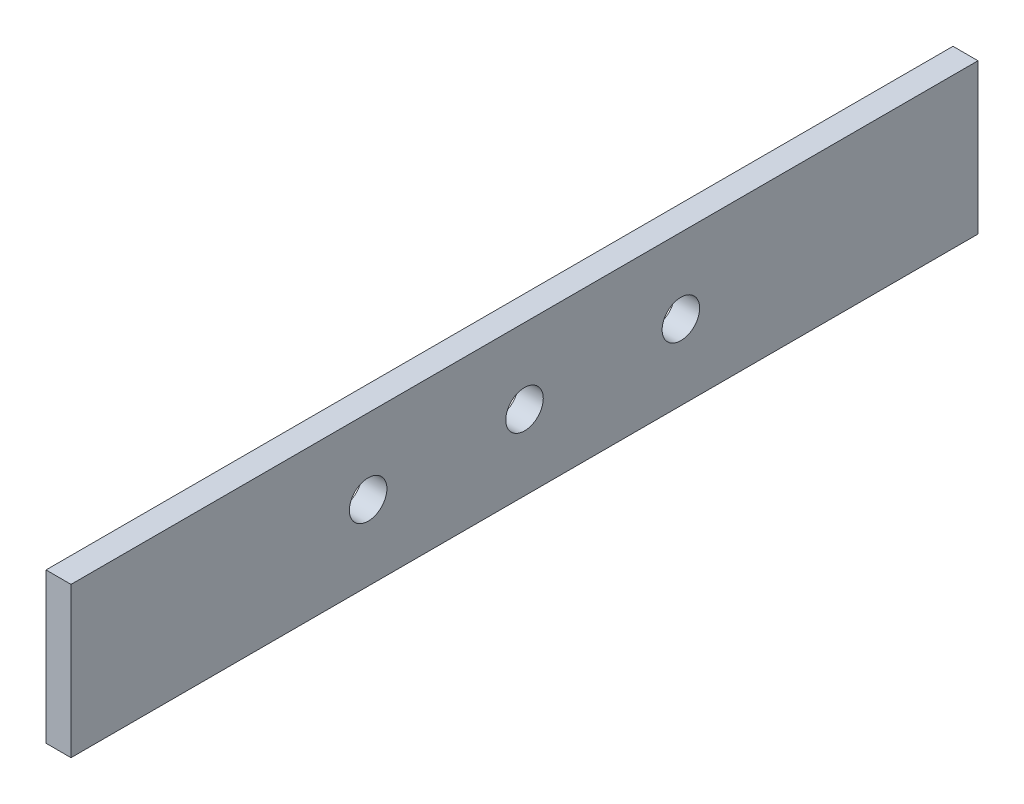
ISO-10303-21;
HEADER;
FILE_DESCRIPTION(('STEP AP214'),'2;1');
FILE_NAME('part.step','',(''),(''),'','','');
FILE_SCHEMA(('AUTOMOTIVE_DESIGN { 1 0 10303 214 1 1 1 1 }'));
ENDSEC;
DATA;
#1=APPLICATION_CONTEXT('core data for automotive mechanical design processes');
#2=APPLICATION_PROTOCOL_DEFINITION('international standard','automotive_design',2000,#1);
#3=PRODUCT_CONTEXT('',#1,'mechanical');
#4=PRODUCT('Part','Part','',(#3));
#5=PRODUCT_RELATED_PRODUCT_CATEGORY('part','',(#4));
#6=PRODUCT_DEFINITION_FORMATION('','',#4);
#7=PRODUCT_DEFINITION_CONTEXT('part definition',#1,'design');
#8=PRODUCT_DEFINITION('design','',#6,#7);
#9=PRODUCT_DEFINITION_SHAPE('','',#8);
#10=(LENGTH_UNIT() NAMED_UNIT(*) SI_UNIT(.MILLI.,.METRE.));
#11=(NAMED_UNIT(*) PLANE_ANGLE_UNIT() SI_UNIT($,.RADIAN.));
#12=(NAMED_UNIT(*) SI_UNIT($,.STERADIAN.) SOLID_ANGLE_UNIT());
#13=UNCERTAINTY_MEASURE_WITH_UNIT(LENGTH_MEASURE(1.E-05),#10,'distance_accuracy_value','');
#14=(GEOMETRIC_REPRESENTATION_CONTEXT(3) GLOBAL_UNCERTAINTY_ASSIGNED_CONTEXT((#13)) GLOBAL_UNIT_ASSIGNED_CONTEXT((#10,
#11,#12)) REPRESENTATION_CONTEXT('',''));
#15=CARTESIAN_POINT('',(0.,0.,0.));
#16=DIRECTION('',(0.,0.,1.));
#17=DIRECTION('',(1.,0.,0.));
#18=AXIS2_PLACEMENT_3D('',#15,#16,#17);
#19=CARTESIAN_POINT('',(2.,12.,23.7475677229017));
#20=DIRECTION('',(0.,0.,-1.));
#21=DIRECTION('',(-1.,0.,0.));
#22=AXIS2_PLACEMENT_3D('',#19,#20,#21);
#23=PLANE('',#22);
#24=DIRECTION('',(0.,-1.,0.));
#25=VECTOR('',#24,1.);
#26=CARTESIAN_POINT('',(0.,12.,23.7475677229017));
#27=LINE('',#26,#25);
#28=CARTESIAN_POINT('',(0.,12.,23.7475677229017));
#29=VERTEX_POINT('',#28);
#30=CARTESIAN_POINT('',(0.,0.,23.7475677229017));
#31=VERTEX_POINT('',#30);
#32=EDGE_CURVE('E96',#29,#31,#27,.T.);
#33=ORIENTED_EDGE('',*,*,#32,.T.);
#34=DIRECTION('',(-1.,0.,0.));
#35=VECTOR('',#34,1.);
#36=CARTESIAN_POINT('',(2.,0.,23.7475677229017));
#37=LINE('',#36,#35);
#38=CARTESIAN_POINT('',(2.,0.,23.7475677229017));
#39=VERTEX_POINT('',#38);
#40=EDGE_CURVE('E11',#39,#31,#37,.T.);
#41=ORIENTED_EDGE('',*,*,#40,.F.);
#42=DIRECTION('',(0.,-1.,0.));
#43=VECTOR('',#42,1.);
#44=CARTESIAN_POINT('',(2.,12.,23.7475677229017));
#45=LINE('',#44,#43);
#46=CARTESIAN_POINT('',(2.,12.,23.7475677229017));
#47=VERTEX_POINT('',#46);
#48=EDGE_CURVE('E84',#47,#39,#45,.T.);
#49=ORIENTED_EDGE('',*,*,#48,.F.);
#50=DIRECTION('',(-1.,0.,0.));
#51=VECTOR('',#50,1.);
#52=CARTESIAN_POINT('',(2.,12.,23.7475677229017));
#53=LINE('',#52,#51);
#54=EDGE_CURVE('E92',#47,#29,#53,.T.);
#55=ORIENTED_EDGE('',*,*,#54,.T.);
#56=EDGE_LOOP('',(#33,#41,#49,#55));
#57=FACE_BOUND('',#56,.T.);
#58=ADVANCED_FACE('F33',(#57),#23,.F.);
#59=CARTESIAN_POINT('',(2.,0.,23.7475677229017));
#60=DIRECTION('',(0.,1.,0.));
#61=DIRECTION('',(0.,0.,1.));
#62=AXIS2_PLACEMENT_3D('',#59,#60,#61);
#63=PLANE('',#62);
#64=DIRECTION('',(0.,0.,-1.));
#65=VECTOR('',#64,1.);
#66=CARTESIAN_POINT('',(0.,0.,23.7475677229017));
#67=LINE('',#66,#65);
#68=CARTESIAN_POINT('',(0.,0.,-48.7524322770983));
#69=VERTEX_POINT('',#68);
#70=EDGE_CURVE('E88',#31,#69,#67,.T.);
#71=ORIENTED_EDGE('',*,*,#70,.T.);
#72=DIRECTION('',(-1.,0.,0.));
#73=VECTOR('',#72,1.);
#74=CARTESIAN_POINT('',(2.,0.,-48.7524322770983));
#75=LINE('',#74,#73);
#76=CARTESIAN_POINT('',(2.,0.,-48.7524322770983));
#77=VERTEX_POINT('',#76);
#78=EDGE_CURVE('E41',#77,#69,#75,.T.);
#79=ORIENTED_EDGE('',*,*,#78,.F.);
#80=DIRECTION('',(0.,0.,-1.));
#81=VECTOR('',#80,1.);
#82=CARTESIAN_POINT('',(2.,0.,23.7475677229017));
#83=LINE('',#82,#81);
#84=EDGE_CURVE('E79',#39,#77,#83,.T.);
#85=ORIENTED_EDGE('',*,*,#84,.F.);
#86=ORIENTED_EDGE('',*,*,#40,.T.);
#87=EDGE_LOOP('',(#71,#79,#85,#86));
#88=FACE_BOUND('',#87,.T.);
#89=ADVANCED_FACE('F87',(#88),#63,.F.);
#90=CARTESIAN_POINT('',(2.,0.,-48.7524322770983));
#91=DIRECTION('',(0.,0.,1.));
#92=DIRECTION('',(1.,0.,0.));
#93=AXIS2_PLACEMENT_3D('',#90,#91,#92);
#94=PLANE('',#93);
#95=DIRECTION('',(0.,1.,0.));
#96=VECTOR('',#95,1.);
#97=CARTESIAN_POINT('',(0.,0.,-48.7524322770983));
#98=LINE('',#97,#96);
#99=CARTESIAN_POINT('',(0.,12.,-48.7524322770983));
#100=VERTEX_POINT('',#99);
#101=EDGE_CURVE('E66',#69,#100,#98,.T.);
#102=ORIENTED_EDGE('',*,*,#101,.T.);
#103=DIRECTION('',(-1.,0.,0.));
#104=VECTOR('',#103,1.);
#105=CARTESIAN_POINT('',(2.,12.,-48.7524322770983));
#106=LINE('',#105,#104);
#107=CARTESIAN_POINT('',(2.,12.,-48.7524322770983));
#108=VERTEX_POINT('',#107);
#109=EDGE_CURVE('E89',#108,#100,#106,.T.);
#110=ORIENTED_EDGE('',*,*,#109,.F.);
#111=DIRECTION('',(0.,1.,0.));
#112=VECTOR('',#111,1.);
#113=CARTESIAN_POINT('',(2.,0.,-48.7524322770983));
#114=LINE('',#113,#112);
#115=EDGE_CURVE('E82',#77,#108,#114,.T.);
#116=ORIENTED_EDGE('',*,*,#115,.F.);
#117=ORIENTED_EDGE('',*,*,#78,.T.);
#118=EDGE_LOOP('',(#102,#110,#116,#117));
#119=FACE_BOUND('',#118,.T.);
#120=ADVANCED_FACE('F90',(#119),#94,.F.);
#121=CARTESIAN_POINT('',(2.,12.,-48.7524322770983));
#122=DIRECTION('',(0.,-1.,0.));
#123=DIRECTION('',(0.,0.,-1.));
#124=AXIS2_PLACEMENT_3D('',#121,#122,#123);
#125=PLANE('',#124);
#126=DIRECTION('',(0.,0.,1.));
#127=VECTOR('',#126,1.);
#128=CARTESIAN_POINT('',(0.,12.,-48.7524322770983));
#129=LINE('',#128,#127);
#130=EDGE_CURVE('E72',#100,#29,#129,.T.);
#131=ORIENTED_EDGE('',*,*,#130,.T.);
#132=ORIENTED_EDGE('',*,*,#54,.F.);
#133=DIRECTION('',(0.,0.,1.));
#134=VECTOR('',#133,1.);
#135=CARTESIAN_POINT('',(2.,12.,-48.7524322770983));
#136=LINE('',#135,#134);
#137=EDGE_CURVE('E49',#108,#47,#136,.T.);
#138=ORIENTED_EDGE('',*,*,#137,.F.);
#139=ORIENTED_EDGE('',*,*,#109,.T.);
#140=EDGE_LOOP('',(#131,#132,#138,#139));
#141=FACE_BOUND('',#140,.T.);
#142=ADVANCED_FACE('F104',(#141),#125,.F.);
#143=CARTESIAN_POINT('',(2.,0.,0.));
#144=DIRECTION('',(1.,0.,0.));
#145=DIRECTION('',(0.,0.,-1.));
#146=AXIS2_PLACEMENT_3D('',#143,#144,#145);
#147=PLANE('',#146);
#148=CARTESIAN_POINT('',(2.,5.99999999999999,-25.0024322770983));
#149=DIRECTION('',(1.,0.,0.));
#150=DIRECTION('',(0.,0.,-1.));
#151=AXIS2_PLACEMENT_3D('',#148,#149,#150);
#152=CIRCLE('',#151,1.5);
#153=CARTESIAN_POINT('',(2.,5.99999999999999,-26.5024322770983));
#154=VERTEX_POINT('',#153);
#155=EDGE_CURVE('E120',#154,#154,#152,.T.);
#156=ORIENTED_EDGE('',*,*,#155,.F.);
#157=EDGE_LOOP('',(#156));
#158=FACE_BOUND('',#157,.T.);
#159=CARTESIAN_POINT('',(2.,5.99999999999999,-0.00243227709826113));
#160=DIRECTION('',(1.,0.,0.));
#161=DIRECTION('',(0.,0.,-1.));
#162=AXIS2_PLACEMENT_3D('',#159,#160,#161);
#163=CIRCLE('',#162,1.5);
#164=CARTESIAN_POINT('',(2.,5.99999999999999,-1.50243227709826));
#165=VERTEX_POINT('',#164);
#166=EDGE_CURVE('E119',#165,#165,#163,.T.);
#167=ORIENTED_EDGE('',*,*,#166,.F.);
#168=EDGE_LOOP('',(#167));
#169=FACE_BOUND('',#168,.T.);
#170=CARTESIAN_POINT('',(2.,5.99999999999999,-12.5024322770983));
#171=DIRECTION('',(1.,0.,0.));
#172=DIRECTION('',(0.,0.,-1.));
#173=AXIS2_PLACEMENT_3D('',#170,#171,#172);
#174=CIRCLE('',#173,1.5);
#175=CARTESIAN_POINT('',(2.,5.99999999999999,-14.0024322770983));
#176=VERTEX_POINT('',#175);
#177=EDGE_CURVE('E112',#176,#176,#174,.T.);
#178=ORIENTED_EDGE('',*,*,#177,.F.);
#179=EDGE_LOOP('',(#178));
#180=FACE_BOUND('',#179,.T.);
#181=ORIENTED_EDGE('',*,*,#48,.T.);
#182=ORIENTED_EDGE('',*,*,#84,.T.);
#183=ORIENTED_EDGE('',*,*,#115,.T.);
#184=ORIENTED_EDGE('',*,*,#137,.T.);
#185=EDGE_LOOP('',(#181,#182,#183,#184));
#186=FACE_BOUND('',#185,.T.);
#187=ADVANCED_FACE('F80',(#158,#169,#180,#186),#147,.T.);
#188=CARTESIAN_POINT('',(0.,0.,0.));
#189=DIRECTION('',(1.,0.,0.));
#190=DIRECTION('',(0.,0.,-1.));
#191=AXIS2_PLACEMENT_3D('',#188,#189,#190);
#192=PLANE('',#191);
#193=CARTESIAN_POINT('',(0.,5.99999999999999,-25.0024322770983));
#194=DIRECTION('',(1.,0.,0.));
#195=DIRECTION('',(0.,0.,-1.));
#196=AXIS2_PLACEMENT_3D('',#193,#194,#195);
#197=CIRCLE('',#196,1.5);
#198=CARTESIAN_POINT('',(0.,5.99999999999999,-26.5024322770983));
#199=VERTEX_POINT('',#198);
#200=EDGE_CURVE('E116',#199,#199,#197,.F.);
#201=ORIENTED_EDGE('',*,*,#200,.F.);
#202=EDGE_LOOP('',(#201));
#203=FACE_BOUND('',#202,.T.);
#204=CARTESIAN_POINT('',(0.,5.99999999999999,-0.00243227709826113));
#205=DIRECTION('',(1.,0.,0.));
#206=DIRECTION('',(0.,0.,-1.));
#207=AXIS2_PLACEMENT_3D('',#204,#205,#206);
#208=CIRCLE('',#207,1.5);
#209=CARTESIAN_POINT('',(0.,5.99999999999999,-1.50243227709826));
#210=VERTEX_POINT('',#209);
#211=EDGE_CURVE('E115',#210,#210,#208,.F.);
#212=ORIENTED_EDGE('',*,*,#211,.F.);
#213=EDGE_LOOP('',(#212));
#214=FACE_BOUND('',#213,.T.);
#215=CARTESIAN_POINT('',(0.,5.99999999999999,-12.5024322770983));
#216=DIRECTION('',(1.,0.,0.));
#217=DIRECTION('',(0.,0.,-1.));
#218=AXIS2_PLACEMENT_3D('',#215,#216,#217);
#219=CIRCLE('',#218,1.5);
#220=CARTESIAN_POINT('',(0.,5.99999999999999,-14.0024322770983));
#221=VERTEX_POINT('',#220);
#222=EDGE_CURVE('E99',#221,#221,#219,.F.);
#223=ORIENTED_EDGE('',*,*,#222,.F.);
#224=EDGE_LOOP('',(#223));
#225=FACE_BOUND('',#224,.T.);
#226=ORIENTED_EDGE('',*,*,#32,.F.);
#227=ORIENTED_EDGE('',*,*,#130,.F.);
#228=ORIENTED_EDGE('',*,*,#101,.F.);
#229=ORIENTED_EDGE('',*,*,#70,.F.);
#230=EDGE_LOOP('',(#226,#227,#228,#229));
#231=FACE_BOUND('',#230,.T.);
#232=ADVANCED_FACE('F107',(#203,#214,#225,#231),#192,.F.);
#233=CARTESIAN_POINT('',(-0.00100000000000013,5.99999999999999,-12.5024322770983));
#234=DIRECTION('',(1.,0.,0.));
#235=DIRECTION('',(0.,0.,-1.));
#236=AXIS2_PLACEMENT_3D('',#233,#234,#235);
#237=CYLINDRICAL_SURFACE('',#236,1.5);
#238=ORIENTED_EDGE('',*,*,#177,.T.);
#239=EDGE_LOOP('',(#238));
#240=FACE_BOUND('',#239,.T.);
#241=ORIENTED_EDGE('',*,*,#222,.T.);
#242=EDGE_LOOP('',(#241));
#243=FACE_BOUND('',#242,.T.);
#244=ADVANCED_FACE('F137',(#240,#243),#237,.F.);
#245=CARTESIAN_POINT('',(-0.00100000000000013,5.99999999999999,-0.00243227709826113));
#246=DIRECTION('',(1.,0.,0.));
#247=DIRECTION('',(0.,0.,-1.));
#248=AXIS2_PLACEMENT_3D('',#245,#246,#247);
#249=CYLINDRICAL_SURFACE('',#248,1.5);
#250=ORIENTED_EDGE('',*,*,#166,.T.);
#251=EDGE_LOOP('',(#250));
#252=FACE_BOUND('',#251,.T.);
#253=ORIENTED_EDGE('',*,*,#211,.T.);
#254=EDGE_LOOP('',(#253));
#255=FACE_BOUND('',#254,.T.);
#256=ADVANCED_FACE('F128',(#252,#255),#249,.F.);
#257=CARTESIAN_POINT('',(-0.00100000000000013,5.99999999999999,-25.0024322770983));
#258=DIRECTION('',(1.,0.,0.));
#259=DIRECTION('',(0.,0.,-1.));
#260=AXIS2_PLACEMENT_3D('',#257,#258,#259);
#261=CYLINDRICAL_SURFACE('',#260,1.5);
#262=ORIENTED_EDGE('',*,*,#155,.T.);
#263=EDGE_LOOP('',(#262));
#264=FACE_BOUND('',#263,.T.);
#265=ORIENTED_EDGE('',*,*,#200,.T.);
#266=EDGE_LOOP('',(#265));
#267=FACE_BOUND('',#266,.T.);
#268=ADVANCED_FACE('F187',(#264,#267),#261,.F.);
#269=CLOSED_SHELL('',(#58,#89,#120,#142,#187,#232,#244,#256,#268));
#270=MANIFOLD_SOLID_BREP('B2',#269);
#271=ADVANCED_BREP_SHAPE_REPRESENTATION('',(#18,#270),#14);
#272=SHAPE_DEFINITION_REPRESENTATION(#9,#271);
ENDSEC;
END-ISO-10303-21;
